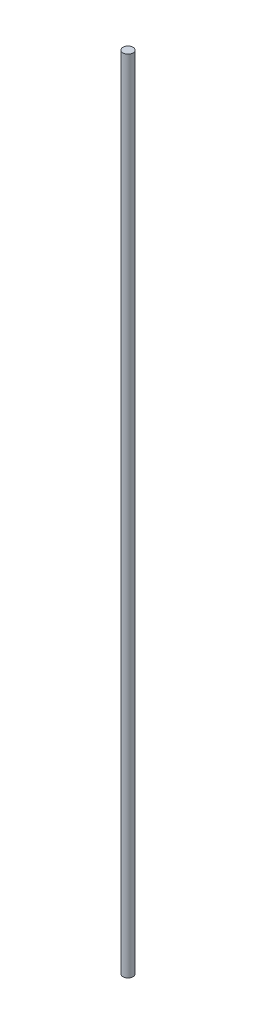
ISO-10303-21;
HEADER;
FILE_DESCRIPTION(('STEP AP214'),'2;1');
FILE_NAME('part.step','',(''),(''),'','','');
FILE_SCHEMA(('AUTOMOTIVE_DESIGN { 1 0 10303 214 1 1 1 1 }'));
ENDSEC;
DATA;
#1=APPLICATION_CONTEXT('core data for automotive mechanical design processes');
#2=APPLICATION_PROTOCOL_DEFINITION('international standard','automotive_design',2000,#1);
#3=PRODUCT_CONTEXT('',#1,'mechanical');
#4=PRODUCT('Part','Part','',(#3));
#5=PRODUCT_RELATED_PRODUCT_CATEGORY('part','',(#4));
#6=PRODUCT_DEFINITION_FORMATION('','',#4);
#7=PRODUCT_DEFINITION_CONTEXT('part definition',#1,'design');
#8=PRODUCT_DEFINITION('design','',#6,#7);
#9=PRODUCT_DEFINITION_SHAPE('','',#8);
#10=(LENGTH_UNIT() NAMED_UNIT(*) SI_UNIT(.MILLI.,.METRE.));
#11=(NAMED_UNIT(*) PLANE_ANGLE_UNIT() SI_UNIT($,.RADIAN.));
#12=(NAMED_UNIT(*) SI_UNIT($,.STERADIAN.) SOLID_ANGLE_UNIT());
#13=UNCERTAINTY_MEASURE_WITH_UNIT(LENGTH_MEASURE(1.E-05),#10,'distance_accuracy_value','');
#14=(GEOMETRIC_REPRESENTATION_CONTEXT(3) GLOBAL_UNCERTAINTY_ASSIGNED_CONTEXT((#13)) GLOBAL_UNIT_ASSIGNED_CONTEXT((#10,
#11,#12)) REPRESENTATION_CONTEXT('',''));
#15=CARTESIAN_POINT('',(0.,0.,0.));
#16=DIRECTION('',(0.,0.,1.));
#17=DIRECTION('',(1.,0.,0.));
#18=AXIS2_PLACEMENT_3D('',#15,#16,#17);
#19=CARTESIAN_POINT('',(0.,203.2,0.));
#20=DIRECTION('',(0.,-1.,0.));
#21=DIRECTION('',(0.,0.,-1.));
#22=AXIS2_PLACEMENT_3D('',#19,#20,#21);
#23=CYLINDRICAL_SURFACE('',#22,1.27);
#24=CARTESIAN_POINT('',(0.,203.2,0.));
#25=DIRECTION('',(0.,1.,0.));
#26=DIRECTION('',(0.,0.,1.));
#27=AXIS2_PLACEMENT_3D('',#24,#25,#26);
#28=CIRCLE('',#27,1.27);
#29=CARTESIAN_POINT('',(0.,203.2,1.27));
#30=VERTEX_POINT('',#29);
#31=EDGE_CURVE('E10',#30,#30,#28,.T.);
#32=ORIENTED_EDGE('',*,*,#31,.F.);
#33=EDGE_LOOP('',(#32));
#34=FACE_BOUND('',#33,.T.);
#35=CARTESIAN_POINT('',(0.,0.,0.));
#36=DIRECTION('',(0.,1.,0.));
#37=DIRECTION('',(0.,0.,1.));
#38=AXIS2_PLACEMENT_3D('',#35,#36,#37);
#39=CIRCLE('',#38,1.27);
#40=CARTESIAN_POINT('',(0.,0.,1.27));
#41=VERTEX_POINT('',#40);
#42=EDGE_CURVE('E33',#41,#41,#39,.T.);
#43=ORIENTED_EDGE('',*,*,#42,.T.);
#44=EDGE_LOOP('',(#43));
#45=FACE_BOUND('',#44,.T.);
#46=ADVANCED_FACE('F30',(#34,#45),#23,.T.);
#47=CARTESIAN_POINT('',(0.,203.2,0.));
#48=DIRECTION('',(0.,1.,0.));
#49=DIRECTION('',(0.,0.,1.));
#50=AXIS2_PLACEMENT_3D('',#47,#48,#49);
#51=PLANE('',#50);
#52=ORIENTED_EDGE('',*,*,#31,.T.);
#53=EDGE_LOOP('',(#52));
#54=FACE_BOUND('',#53,.T.);
#55=ADVANCED_FACE('F45',(#54),#51,.T.);
#56=CARTESIAN_POINT('',(0.,0.,0.));
#57=DIRECTION('',(0.,1.,0.));
#58=DIRECTION('',(0.,0.,1.));
#59=AXIS2_PLACEMENT_3D('',#56,#57,#58);
#60=PLANE('',#59);
#61=ORIENTED_EDGE('',*,*,#42,.F.);
#62=EDGE_LOOP('',(#61));
#63=FACE_BOUND('',#62,.T.);
#64=ADVANCED_FACE('F43',(#63),#60,.F.);
#65=CLOSED_SHELL('',(#46,#55,#64));
#66=MANIFOLD_SOLID_BREP('B2',#65);
#67=ADVANCED_BREP_SHAPE_REPRESENTATION('',(#18,#66),#14);
#68=SHAPE_DEFINITION_REPRESENTATION(#9,#67);
ENDSEC;
END-ISO-10303-21;
